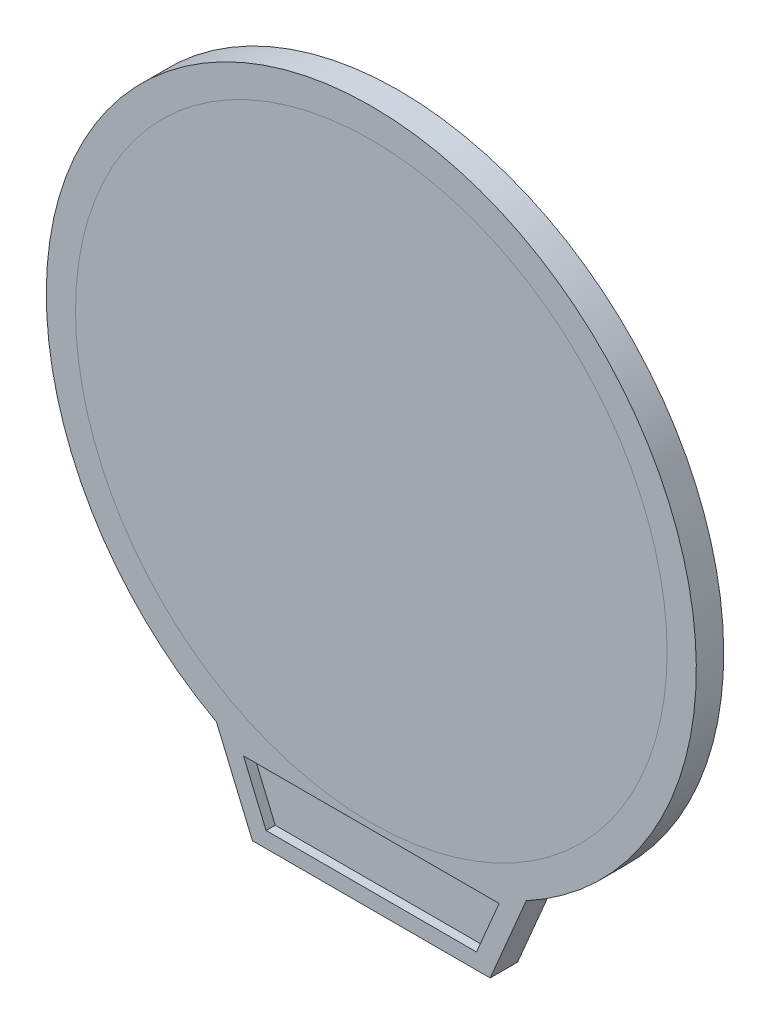
ISO-10303-21;
HEADER;
FILE_DESCRIPTION(('STEP AP214'),'2;1');
FILE_NAME('part.step','',(''),(''),'','','');
FILE_SCHEMA(('AUTOMOTIVE_DESIGN { 1 0 10303 214 1 1 1 1 }'));
ENDSEC;
DATA;
#1=APPLICATION_CONTEXT('core data for automotive mechanical design processes');
#2=APPLICATION_PROTOCOL_DEFINITION('international standard','automotive_design',2000,#1);
#3=PRODUCT_CONTEXT('',#1,'mechanical');
#4=PRODUCT('Part','Part','',(#3));
#5=PRODUCT_RELATED_PRODUCT_CATEGORY('part','',(#4));
#6=PRODUCT_DEFINITION_FORMATION('','',#4);
#7=PRODUCT_DEFINITION_CONTEXT('part definition',#1,'design');
#8=PRODUCT_DEFINITION('design','',#6,#7);
#9=PRODUCT_DEFINITION_SHAPE('','',#8);
#10=(LENGTH_UNIT() NAMED_UNIT(*) SI_UNIT(.MILLI.,.METRE.));
#11=(NAMED_UNIT(*) PLANE_ANGLE_UNIT() SI_UNIT($,.RADIAN.));
#12=(NAMED_UNIT(*) SI_UNIT($,.STERADIAN.) SOLID_ANGLE_UNIT());
#13=UNCERTAINTY_MEASURE_WITH_UNIT(LENGTH_MEASURE(1.E-05),#10,'distance_accuracy_value','');
#14=(GEOMETRIC_REPRESENTATION_CONTEXT(3) GLOBAL_UNCERTAINTY_ASSIGNED_CONTEXT((#13)) GLOBAL_UNIT_ASSIGNED_CONTEXT((#10,
#11,#12)) REPRESENTATION_CONTEXT('',''));
#15=CARTESIAN_POINT('',(0.,0.,0.));
#16=DIRECTION('',(0.,0.,1.));
#17=DIRECTION('',(1.,0.,0.));
#18=AXIS2_PLACEMENT_3D('',#15,#16,#17);
#19=CARTESIAN_POINT('',(-6.51,-20.3,-0.01));
#20=DIRECTION('',(0.,-1.,0.));
#21=DIRECTION('',(0.,0.,-1.));
#22=AXIS2_PLACEMENT_3D('',#19,#20,#21);
#23=PLANE('',#22);
#24=DIRECTION('',(0.,0.,1.));
#25=VECTOR('',#24,1.);
#26=CARTESIAN_POINT('',(-6.51,-20.3,0.));
#27=LINE('',#26,#25);
#28=CARTESIAN_POINT('',(-6.51,-20.3,0.));
#29=VERTEX_POINT('',#28);
#30=CARTESIAN_POINT('',(-6.51,-20.3,1.5));
#31=VERTEX_POINT('',#30);
#32=EDGE_CURVE('E161',#29,#31,#27,.T.);
#33=ORIENTED_EDGE('',*,*,#32,.F.);
#34=DIRECTION('',(1.,0.,0.));
#35=VECTOR('',#34,1.);
#36=CARTESIAN_POINT('',(-6.51,-20.3,0.));
#37=LINE('',#36,#35);
#38=CARTESIAN_POINT('',(6.51,-20.3,0.));
#39=VERTEX_POINT('',#38);
#40=EDGE_CURVE('E142',#29,#39,#37,.T.);
#41=ORIENTED_EDGE('',*,*,#40,.T.);
#42=DIRECTION('',(0.,0.,1.));
#43=VECTOR('',#42,1.);
#44=CARTESIAN_POINT('',(6.51,-20.3,0.));
#45=LINE('',#44,#43);
#46=CARTESIAN_POINT('',(6.51,-20.3,1.5));
#47=VERTEX_POINT('',#46);
#48=EDGE_CURVE('E158',#39,#47,#45,.T.);
#49=ORIENTED_EDGE('',*,*,#48,.T.);
#50=DIRECTION('',(1.,0.,0.));
#51=VECTOR('',#50,1.);
#52=CARTESIAN_POINT('',(-6.51,-20.3,1.5));
#53=LINE('',#52,#51);
#54=EDGE_CURVE('E150',#31,#47,#53,.T.);
#55=ORIENTED_EDGE('',*,*,#54,.F.);
#56=EDGE_LOOP('',(#33,#41,#49,#55));
#57=FACE_BOUND('',#56,.T.);
#58=ADVANCED_FACE('F38',(#57),#23,.T.);
#59=CARTESIAN_POINT('',(-8.48482079928986,-15.647613747915,0.));
#60=DIRECTION('',(-0.920504853452441,-0.390731128489271,0.));
#61=DIRECTION('',(0.390731128489271,-0.920504853452441,0.));
#62=AXIS2_PLACEMENT_3D('',#59,#60,#61);
#63=PLANE('',#62);
#64=DIRECTION('',(0.390731128489271,-0.920504853452441,0.));
#65=VECTOR('',#64,1.);
#66=CARTESIAN_POINT('',(-8.48482079928986,-15.647613747915,1.5));
#67=LINE('',#66,#65);
#68=CARTESIAN_POINT('',(-8.48482079928986,-15.647613747915,1.5));
#69=VERTEX_POINT('',#68);
#70=EDGE_CURVE('E135',#69,#31,#67,.T.);
#71=ORIENTED_EDGE('',*,*,#70,.F.);
#72=DIRECTION('',(0.,0.,1.));
#73=VECTOR('',#72,1.);
#74=CARTESIAN_POINT('',(-8.48482079928986,-15.647613747915,0.));
#75=LINE('',#74,#73);
#76=CARTESIAN_POINT('',(-8.48482079928986,-15.647613747915,0.));
#77=VERTEX_POINT('',#76);
#78=EDGE_CURVE('E147',#77,#69,#75,.T.);
#79=ORIENTED_EDGE('',*,*,#78,.F.);
#80=DIRECTION('',(0.390731128489271,-0.920504853452441,0.));
#81=VECTOR('',#80,1.);
#82=CARTESIAN_POINT('',(-8.48482079928986,-15.647613747915,0.));
#83=LINE('',#82,#81);
#84=EDGE_CURVE('E138',#77,#29,#83,.T.);
#85=ORIENTED_EDGE('',*,*,#84,.T.);
#86=ORIENTED_EDGE('',*,*,#32,.T.);
#87=EDGE_LOOP('',(#71,#79,#85,#86));
#88=FACE_BOUND('',#87,.T.);
#89=ADVANCED_FACE('F188',(#88),#63,.T.);
#90=CARTESIAN_POINT('',(0.,0.,1.5));
#91=DIRECTION('',(0.,0.,-1.));
#92=DIRECTION('',(-1.,0.,0.));
#93=AXIS2_PLACEMENT_3D('',#90,#91,#92);
#94=CYLINDRICAL_SURFACE('',#93,17.8);
#95=CARTESIAN_POINT('',(0.,0.,1.5));
#96=DIRECTION('',(0.,0.,1.));
#97=DIRECTION('',(1.,0.,0.));
#98=AXIS2_PLACEMENT_3D('',#95,#96,#97);
#99=CIRCLE('',#98,17.8);
#100=CARTESIAN_POINT('',(8.48482079928987,-15.647613747915,1.5));
#101=VERTEX_POINT('',#100);
#102=EDGE_CURVE('E164',#101,#69,#99,.T.);
#103=ORIENTED_EDGE('',*,*,#102,.F.);
#104=DIRECTION('',(0.,0.,1.));
#105=VECTOR('',#104,1.);
#106=CARTESIAN_POINT('',(8.48482079928987,-15.647613747915,0.));
#107=LINE('',#106,#105);
#108=CARTESIAN_POINT('',(8.48482079928987,-15.647613747915,0.));
#109=VERTEX_POINT('',#108);
#110=EDGE_CURVE('E155',#109,#101,#107,.T.);
#111=ORIENTED_EDGE('',*,*,#110,.F.);
#112=CARTESIAN_POINT('',(0.,0.,0.));
#113=DIRECTION('',(0.,0.,1.));
#114=DIRECTION('',(1.,0.,0.));
#115=AXIS2_PLACEMENT_3D('',#112,#113,#114);
#116=CIRCLE('',#115,17.8);
#117=EDGE_CURVE('E159',#109,#77,#116,.T.);
#118=ORIENTED_EDGE('',*,*,#117,.T.);
#119=ORIENTED_EDGE('',*,*,#78,.T.);
#120=EDGE_LOOP('',(#103,#111,#118,#119));
#121=FACE_BOUND('',#120,.T.);
#122=ADVANCED_FACE('F190',(#121),#94,.T.);
#123=CARTESIAN_POINT('',(0.,0.,0.));
#124=DIRECTION('',(0.,0.,1.));
#125=DIRECTION('',(1.,0.,0.));
#126=AXIS2_PLACEMENT_3D('',#123,#124,#125);
#127=PLANE('',#126);
#128=ORIENTED_EDGE('',*,*,#40,.F.);
#129=ORIENTED_EDGE('',*,*,#84,.F.);
#130=ORIENTED_EDGE('',*,*,#117,.F.);
#131=DIRECTION('',(0.39073112848927,0.920504853452442,0.));
#132=VECTOR('',#131,1.);
#133=CARTESIAN_POINT('',(6.51,-20.3,0.));
#134=LINE('',#133,#132);
#135=EDGE_CURVE('E144',#39,#109,#134,.T.);
#136=ORIENTED_EDGE('',*,*,#135,.F.);
#137=EDGE_LOOP('',(#128,#129,#130,#136));
#138=FACE_BOUND('',#137,.T.);
#139=ADVANCED_FACE('F40',(#138),#127,.F.);
#140=CARTESIAN_POINT('',(0.,0.,1.));
#141=DIRECTION('',(0.,0.,1.));
#142=DIRECTION('',(1.,0.,0.));
#143=AXIS2_PLACEMENT_3D('',#140,#141,#142);
#144=PLANE('',#143);
#145=DIRECTION('',(0.390731128489271,-0.920504853452441,0.));
#146=VECTOR('',#145,1.);
#147=CARTESIAN_POINT('',(-7.,-16.52,1.));
#148=LINE('',#147,#146);
#149=CARTESIAN_POINT('',(-7.,-16.52,1.));
#150=VERTEX_POINT('',#149);
#151=CARTESIAN_POINT('',(-5.76053353666796,-19.44,1.));
#152=VERTEX_POINT('',#151);
#153=EDGE_CURVE('E42',#150,#152,#148,.T.);
#154=ORIENTED_EDGE('',*,*,#153,.T.);
#155=DIRECTION('',(1.,0.,0.));
#156=VECTOR('',#155,1.);
#157=CARTESIAN_POINT('',(-5.76053353666796,-19.44,1.));
#158=LINE('',#157,#156);
#159=CARTESIAN_POINT('',(5.76053353666797,-19.44,1.));
#160=VERTEX_POINT('',#159);
#161=EDGE_CURVE('E114',#152,#160,#158,.T.);
#162=ORIENTED_EDGE('',*,*,#161,.T.);
#163=DIRECTION('',(0.390731128489271,0.920504853452441,0.));
#164=VECTOR('',#163,1.);
#165=CARTESIAN_POINT('',(7.,-16.52,1.));
#166=LINE('',#165,#164);
#167=CARTESIAN_POINT('',(7.,-16.52,1.));
#168=VERTEX_POINT('',#167);
#169=EDGE_CURVE('E128',#160,#168,#166,.T.);
#170=ORIENTED_EDGE('',*,*,#169,.T.);
#171=DIRECTION('',(-1.,0.,0.));
#172=VECTOR('',#171,1.);
#173=CARTESIAN_POINT('',(-7.,-16.52,1.));
#174=LINE('',#173,#172);
#175=EDGE_CURVE('E116',#168,#150,#174,.T.);
#176=ORIENTED_EDGE('',*,*,#175,.T.);
#177=EDGE_LOOP('',(#154,#162,#170,#176));
#178=FACE_BOUND('',#177,.T.);
#179=ADVANCED_FACE('F174',(#178),#144,.T.);
#180=CARTESIAN_POINT('',(0.,0.,1.5));
#181=DIRECTION('',(0.,0.,1.));
#182=DIRECTION('',(1.,0.,0.));
#183=AXIS2_PLACEMENT_3D('',#180,#181,#182);
#184=PLANE('',#183);
#185=CARTESIAN_POINT('',(0.,0.,1.5));
#186=DIRECTION('',(0.,0.,1.));
#187=DIRECTION('',(1.,0.,0.));
#188=AXIS2_PLACEMENT_3D('',#185,#186,#187);
#189=CIRCLE('',#188,16.2);
#190=CARTESIAN_POINT('',(16.2,0.,1.5));
#191=VERTEX_POINT('',#190);
#192=EDGE_CURVE('E167',#191,#191,#189,.F.);
#193=ORIENTED_EDGE('',*,*,#192,.F.);
#194=EDGE_LOOP('',(#193));
#195=FACE_BOUND('',#194,.T.);
#196=ADVANCED_FACE('F172',(#195),#184,.T.);
#197=CARTESIAN_POINT('',(-5.76053353666796,-19.44,1.));
#198=DIRECTION('',(0.,-1.,0.));
#199=DIRECTION('',(0.,0.,-1.));
#200=AXIS2_PLACEMENT_3D('',#197,#198,#199);
#201=PLANE('',#200);
#202=DIRECTION('',(1.,0.,0.));
#203=VECTOR('',#202,1.);
#204=CARTESIAN_POINT('',(-5.76053353666796,-19.44,1.5));
#205=LINE('',#204,#203);
#206=CARTESIAN_POINT('',(-5.76053353666796,-19.44,1.5));
#207=VERTEX_POINT('',#206);
#208=CARTESIAN_POINT('',(5.76053353666797,-19.44,1.5));
#209=VERTEX_POINT('',#208);
#210=EDGE_CURVE('E48',#207,#209,#205,.T.);
#211=ORIENTED_EDGE('',*,*,#210,.T.);
#212=DIRECTION('',(0.,0.,1.));
#213=VECTOR('',#212,1.);
#214=CARTESIAN_POINT('',(5.76053353666797,-19.44,1.));
#215=LINE('',#214,#213);
#216=EDGE_CURVE('E57',#160,#209,#215,.T.);
#217=ORIENTED_EDGE('',*,*,#216,.F.);
#218=ORIENTED_EDGE('',*,*,#161,.F.);
#219=DIRECTION('',(0.,0.,1.));
#220=VECTOR('',#219,1.);
#221=CARTESIAN_POINT('',(-5.76053353666796,-19.44,1.));
#222=LINE('',#221,#220);
#223=EDGE_CURVE('E77',#152,#207,#222,.T.);
#224=ORIENTED_EDGE('',*,*,#223,.T.);
#225=EDGE_LOOP('',(#211,#217,#218,#224));
#226=FACE_BOUND('',#225,.T.);
#227=ADVANCED_FACE('F111',(#226),#201,.F.);
#228=CARTESIAN_POINT('',(7.,-16.52,1.));
#229=DIRECTION('',(0.920504853452441,-0.390731128489271,0.));
#230=DIRECTION('',(0.390731128489271,0.920504853452441,0.));
#231=AXIS2_PLACEMENT_3D('',#228,#229,#230);
#232=PLANE('',#231);
#233=DIRECTION('',(0.390731128489271,0.920504853452441,0.));
#234=VECTOR('',#233,1.);
#235=CARTESIAN_POINT('',(7.,-16.52,1.5));
#236=LINE('',#235,#234);
#237=CARTESIAN_POINT('',(7.,-16.52,1.5));
#238=VERTEX_POINT('',#237);
#239=EDGE_CURVE('E120',#209,#238,#236,.T.);
#240=ORIENTED_EDGE('',*,*,#239,.T.);
#241=DIRECTION('',(0.,0.,1.));
#242=VECTOR('',#241,1.);
#243=CARTESIAN_POINT('',(7.,-16.52,1.));
#244=LINE('',#243,#242);
#245=EDGE_CURVE('E134',#168,#238,#244,.T.);
#246=ORIENTED_EDGE('',*,*,#245,.F.);
#247=ORIENTED_EDGE('',*,*,#169,.F.);
#248=ORIENTED_EDGE('',*,*,#216,.T.);
#249=EDGE_LOOP('',(#240,#246,#247,#248));
#250=FACE_BOUND('',#249,.T.);
#251=ADVANCED_FACE('F180',(#250),#232,.F.);
#252=CARTESIAN_POINT('',(-7.,-16.52,1.));
#253=DIRECTION('',(0.,1.,0.));
#254=DIRECTION('',(0.,0.,1.));
#255=AXIS2_PLACEMENT_3D('',#252,#253,#254);
#256=PLANE('',#255);
#257=DIRECTION('',(-1.,0.,0.));
#258=VECTOR('',#257,1.);
#259=CARTESIAN_POINT('',(-7.,-16.52,1.5));
#260=LINE('',#259,#258);
#261=CARTESIAN_POINT('',(-7.,-16.52,1.5));
#262=VERTEX_POINT('',#261);
#263=EDGE_CURVE('E122',#238,#262,#260,.T.);
#264=ORIENTED_EDGE('',*,*,#263,.T.);
#265=DIRECTION('',(0.,0.,1.));
#266=VECTOR('',#265,1.);
#267=CARTESIAN_POINT('',(-7.,-16.52,1.));
#268=LINE('',#267,#266);
#269=EDGE_CURVE('E79',#150,#262,#268,.T.);
#270=ORIENTED_EDGE('',*,*,#269,.F.);
#271=ORIENTED_EDGE('',*,*,#175,.F.);
#272=ORIENTED_EDGE('',*,*,#245,.T.);
#273=EDGE_LOOP('',(#264,#270,#271,#272));
#274=FACE_BOUND('',#273,.T.);
#275=ADVANCED_FACE('F204',(#274),#256,.F.);
#276=CARTESIAN_POINT('',(-7.,-16.52,1.));
#277=DIRECTION('',(-0.920504853452441,-0.390731128489271,0.));
#278=DIRECTION('',(0.390731128489271,-0.920504853452441,0.));
#279=AXIS2_PLACEMENT_3D('',#276,#277,#278);
#280=PLANE('',#279);
#281=DIRECTION('',(0.390731128489271,-0.920504853452441,0.));
#282=VECTOR('',#281,1.);
#283=CARTESIAN_POINT('',(-7.,-16.52,1.5));
#284=LINE('',#283,#282);
#285=EDGE_CURVE('E11',#262,#207,#284,.T.);
#286=ORIENTED_EDGE('',*,*,#285,.T.);
#287=ORIENTED_EDGE('',*,*,#223,.F.);
#288=ORIENTED_EDGE('',*,*,#153,.F.);
#289=ORIENTED_EDGE('',*,*,#269,.T.);
#290=EDGE_LOOP('',(#286,#287,#288,#289));
#291=FACE_BOUND('',#290,.T.);
#292=ADVANCED_FACE('F107',(#291),#280,.F.);
#293=ORIENTED_EDGE('',*,*,#102,.T.);
#294=ORIENTED_EDGE('',*,*,#70,.T.);
#295=ORIENTED_EDGE('',*,*,#54,.T.);
#296=DIRECTION('',(0.39073112848927,0.920504853452442,0.));
#297=VECTOR('',#296,1.);
#298=CARTESIAN_POINT('',(6.51,-20.3,1.5));
#299=LINE('',#298,#297);
#300=EDGE_CURVE('E141',#47,#101,#299,.T.);
#301=ORIENTED_EDGE('',*,*,#300,.T.);
#302=EDGE_LOOP('',(#293,#294,#295,#301));
#303=FACE_BOUND('',#302,.T.);
#304=ORIENTED_EDGE('',*,*,#285,.F.);
#305=ORIENTED_EDGE('',*,*,#263,.F.);
#306=ORIENTED_EDGE('',*,*,#239,.F.);
#307=ORIENTED_EDGE('',*,*,#210,.F.);
#308=EDGE_LOOP('',(#304,#305,#306,#307));
#309=FACE_BOUND('',#308,.T.);
#310=ORIENTED_EDGE('',*,*,#192,.T.);
#311=EDGE_LOOP('',(#310));
#312=FACE_BOUND('',#311,.T.);
#313=ADVANCED_FACE('F118',(#303,#309,#312),#184,.T.);
#314=CARTESIAN_POINT('',(6.51,-20.3,0.));
#315=DIRECTION('',(0.920504853452442,-0.39073112848927,0.));
#316=DIRECTION('',(0.39073112848927,0.920504853452442,0.));
#317=AXIS2_PLACEMENT_3D('',#314,#315,#316);
#318=PLANE('',#317);
#319=ORIENTED_EDGE('',*,*,#300,.F.);
#320=ORIENTED_EDGE('',*,*,#48,.F.);
#321=ORIENTED_EDGE('',*,*,#135,.T.);
#322=ORIENTED_EDGE('',*,*,#110,.T.);
#323=EDGE_LOOP('',(#319,#320,#321,#322));
#324=FACE_BOUND('',#323,.T.);
#325=ADVANCED_FACE('F186',(#324),#318,.T.);
#326=CLOSED_SHELL('',(#58,#89,#122,#139,#179,#196,#227,#251,#275,#292,#313,#325));
#327=MANIFOLD_SOLID_BREP('B2',#326);
#328=ADVANCED_BREP_SHAPE_REPRESENTATION('',(#18,#327),#14);
#329=SHAPE_DEFINITION_REPRESENTATION(#9,#328);
ENDSEC;
END-ISO-10303-21;
